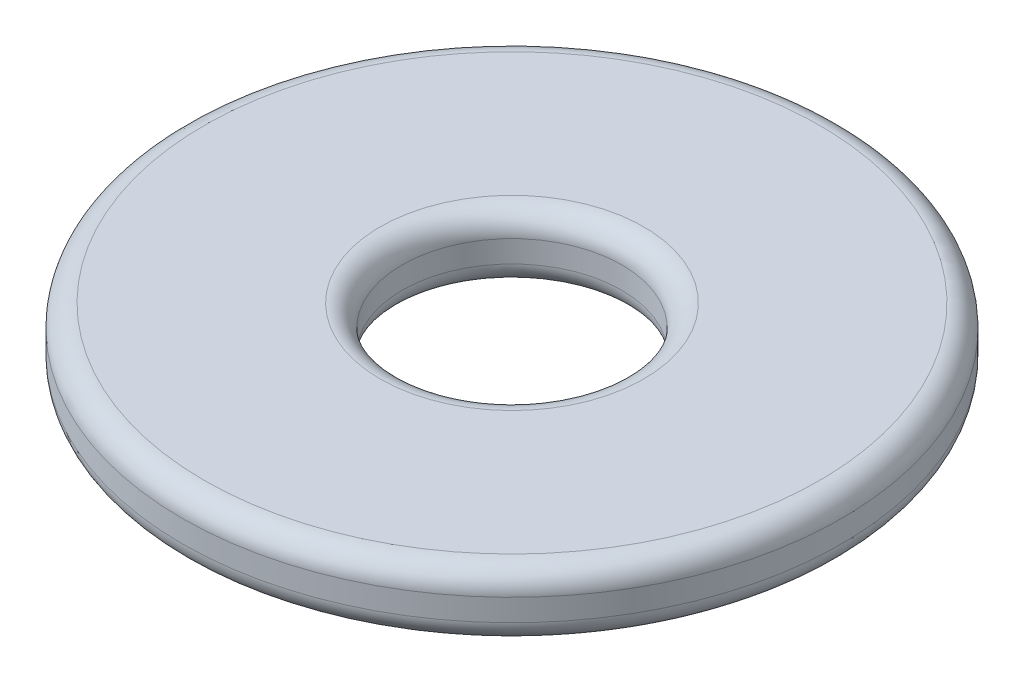
ISO-10303-21;
HEADER;
FILE_DESCRIPTION(('STEP AP214'),'2;1');
FILE_NAME('part.step','',(''),(''),'','','');
FILE_SCHEMA(('AUTOMOTIVE_DESIGN { 1 0 10303 214 1 1 1 1 }'));
ENDSEC;
DATA;
#1=APPLICATION_CONTEXT('core data for automotive mechanical design processes');
#2=APPLICATION_PROTOCOL_DEFINITION('international standard','automotive_design',2000,#1);
#3=PRODUCT_CONTEXT('',#1,'mechanical');
#4=PRODUCT('Part','Part','',(#3));
#5=PRODUCT_RELATED_PRODUCT_CATEGORY('part','',(#4));
#6=PRODUCT_DEFINITION_FORMATION('','',#4);
#7=PRODUCT_DEFINITION_CONTEXT('part definition',#1,'design');
#8=PRODUCT_DEFINITION('design','',#6,#7);
#9=PRODUCT_DEFINITION_SHAPE('','',#8);
#10=(LENGTH_UNIT() NAMED_UNIT(*) SI_UNIT(.MILLI.,.METRE.));
#11=(NAMED_UNIT(*) PLANE_ANGLE_UNIT() SI_UNIT($,.RADIAN.));
#12=(NAMED_UNIT(*) SI_UNIT($,.STERADIAN.) SOLID_ANGLE_UNIT());
#13=UNCERTAINTY_MEASURE_WITH_UNIT(LENGTH_MEASURE(1.E-05),#10,'distance_accuracy_value','');
#14=(GEOMETRIC_REPRESENTATION_CONTEXT(3) GLOBAL_UNCERTAINTY_ASSIGNED_CONTEXT((#13)) GLOBAL_UNIT_ASSIGNED_CONTEXT((#10,
#11,#12)) REPRESENTATION_CONTEXT('',''));
#15=CARTESIAN_POINT('',(0.,0.,0.));
#16=DIRECTION('',(0.,0.,1.));
#17=DIRECTION('',(1.,0.,0.));
#18=AXIS2_PLACEMENT_3D('',#15,#16,#17);
#19=CARTESIAN_POINT('',(0.,1.2,0.));
#20=DIRECTION('',(0.,1.,0.));
#21=DIRECTION('',(0.,0.,1.));
#22=AXIS2_PLACEMENT_3D('',#19,#20,#21);
#23=PLANE('',#22);
#24=CARTESIAN_POINT('',(0.,1.2,0.));
#25=DIRECTION('',(0.,1.,0.));
#26=DIRECTION('',(0.,0.,1.));
#27=AXIS2_PLACEMENT_3D('',#24,#25,#26);
#28=CIRCLE('',#27,2.4);
#29=CARTESIAN_POINT('',(0.,1.2,2.4));
#30=VERTEX_POINT('',#29);
#31=EDGE_CURVE('E50',#30,#30,#28,.F.);
#32=ORIENTED_EDGE('',*,*,#31,.T.);
#33=EDGE_LOOP('',(#32));
#34=FACE_BOUND('',#33,.T.);
#35=CARTESIAN_POINT('',(0.,1.2,0.));
#36=DIRECTION('',(0.,1.,0.));
#37=DIRECTION('',(0.,0.,1.));
#38=AXIS2_PLACEMENT_3D('',#35,#36,#37);
#39=CIRCLE('',#38,5.6);
#40=CARTESIAN_POINT('',(0.,1.2,5.6));
#41=VERTEX_POINT('',#40);
#42=EDGE_CURVE('E54',#41,#41,#39,.T.);
#43=ORIENTED_EDGE('',*,*,#42,.T.);
#44=EDGE_LOOP('',(#43));
#45=FACE_BOUND('',#44,.T.);
#46=ADVANCED_FACE('F39',(#34,#45),#23,.T.);
#47=CARTESIAN_POINT('',(0.,0.,0.));
#48=DIRECTION('',(0.,1.,0.));
#49=DIRECTION('',(0.,0.,1.));
#50=AXIS2_PLACEMENT_3D('',#47,#48,#49);
#51=PLANE('',#50);
#52=CARTESIAN_POINT('',(0.,0.,0.));
#53=DIRECTION('',(0.,1.,0.));
#54=DIRECTION('',(0.,0.,1.));
#55=AXIS2_PLACEMENT_3D('',#52,#53,#54);
#56=CIRCLE('',#55,2.4);
#57=CARTESIAN_POINT('',(0.,0.,2.4));
#58=VERTEX_POINT('',#57);
#59=EDGE_CURVE('E65',#58,#58,#56,.T.);
#60=ORIENTED_EDGE('',*,*,#59,.T.);
#61=EDGE_LOOP('',(#60));
#62=FACE_BOUND('',#61,.T.);
#63=CARTESIAN_POINT('',(0.,0.,0.));
#64=DIRECTION('',(0.,1.,0.));
#65=DIRECTION('',(0.,0.,1.));
#66=AXIS2_PLACEMENT_3D('',#63,#64,#65);
#67=CIRCLE('',#66,5.6);
#68=CARTESIAN_POINT('',(0.,0.,5.6));
#69=VERTEX_POINT('',#68);
#70=EDGE_CURVE('E68',#69,#69,#67,.F.);
#71=ORIENTED_EDGE('',*,*,#70,.T.);
#72=EDGE_LOOP('',(#71));
#73=FACE_BOUND('',#72,.T.);
#74=ADVANCED_FACE('F72',(#62,#73),#51,.F.);
#75=CARTESIAN_POINT('',(0.,1.2,0.));
#76=DIRECTION('',(0.,-1.,0.));
#77=DIRECTION('',(0.,0.,-1.));
#78=AXIS2_PLACEMENT_3D('',#75,#76,#77);
#79=CYLINDRICAL_SURFACE('',#78,6.);
#80=CARTESIAN_POINT('',(0.,0.4,0.));
#81=DIRECTION('',(0.,1.,0.));
#82=DIRECTION('',(0.,0.,1.));
#83=AXIS2_PLACEMENT_3D('',#80,#81,#82);
#84=CIRCLE('',#83,6.);
#85=CARTESIAN_POINT('',(0.,0.4,6.));
#86=VERTEX_POINT('',#85);
#87=EDGE_CURVE('E10',#86,#86,#84,.T.);
#88=ORIENTED_EDGE('',*,*,#87,.T.);
#89=EDGE_LOOP('',(#88));
#90=FACE_BOUND('',#89,.T.);
#91=CARTESIAN_POINT('',(0.,0.8,0.));
#92=DIRECTION('',(0.,1.,0.));
#93=DIRECTION('',(0.,0.,1.));
#94=AXIS2_PLACEMENT_3D('',#91,#92,#93);
#95=CIRCLE('',#94,6.);
#96=CARTESIAN_POINT('',(0.,0.8,6.));
#97=VERTEX_POINT('',#96);
#98=EDGE_CURVE('E46',#97,#97,#95,.F.);
#99=ORIENTED_EDGE('',*,*,#98,.T.);
#100=EDGE_LOOP('',(#99));
#101=FACE_BOUND('',#100,.T.);
#102=ADVANCED_FACE('F92',(#90,#101),#79,.T.);
#103=CARTESIAN_POINT('',(0.,1.2,0.));
#104=DIRECTION('',(0.,-1.,0.));
#105=DIRECTION('',(0.,0.,-1.));
#106=AXIS2_PLACEMENT_3D('',#103,#104,#105);
#107=CYLINDRICAL_SURFACE('',#106,2.);
#108=CARTESIAN_POINT('',(0.,0.4,0.));
#109=DIRECTION('',(0.,1.,0.));
#110=DIRECTION('',(0.,0.,1.));
#111=AXIS2_PLACEMENT_3D('',#108,#109,#110);
#112=CIRCLE('',#111,2.);
#113=CARTESIAN_POINT('',(0.,0.4,2.));
#114=VERTEX_POINT('',#113);
#115=EDGE_CURVE('E59',#114,#114,#112,.F.);
#116=ORIENTED_EDGE('',*,*,#115,.T.);
#117=EDGE_LOOP('',(#116));
#118=FACE_BOUND('',#117,.T.);
#119=CARTESIAN_POINT('',(0.,0.8,0.));
#120=DIRECTION('',(0.,1.,0.));
#121=DIRECTION('',(0.,0.,1.));
#122=AXIS2_PLACEMENT_3D('',#119,#120,#121);
#123=CIRCLE('',#122,2.);
#124=CARTESIAN_POINT('',(0.,0.8,2.));
#125=VERTEX_POINT('',#124);
#126=EDGE_CURVE('E62',#125,#125,#123,.T.);
#127=ORIENTED_EDGE('',*,*,#126,.T.);
#128=EDGE_LOOP('',(#127));
#129=FACE_BOUND('',#128,.T.);
#130=ADVANCED_FACE('F97',(#118,#129),#107,.F.);
#131=CARTESIAN_POINT('',(0.,0.4,0.));
#132=DIRECTION('',(0.,1.,0.));
#133=DIRECTION('',(0.,0.,1.));
#134=AXIS2_PLACEMENT_3D('',#131,#132,#133);
#135=TOROIDAL_SURFACE('',#134,2.4,0.4);
#136=ORIENTED_EDGE('',*,*,#115,.F.);
#137=EDGE_LOOP('',(#136));
#138=FACE_BOUND('',#137,.T.);
#139=ORIENTED_EDGE('',*,*,#59,.F.);
#140=EDGE_LOOP('',(#139));
#141=FACE_BOUND('',#140,.T.);
#142=ADVANCED_FACE('F83',(#138,#141),#135,.T.);
#143=CARTESIAN_POINT('',(0.,0.8,0.));
#144=DIRECTION('',(0.,1.,0.));
#145=DIRECTION('',(0.,0.,1.));
#146=AXIS2_PLACEMENT_3D('',#143,#144,#145);
#147=TOROIDAL_SURFACE('',#146,2.4,0.4);
#148=ORIENTED_EDGE('',*,*,#31,.F.);
#149=EDGE_LOOP('',(#148));
#150=FACE_BOUND('',#149,.T.);
#151=ORIENTED_EDGE('',*,*,#126,.F.);
#152=EDGE_LOOP('',(#151));
#153=FACE_BOUND('',#152,.T.);
#154=ADVANCED_FACE('F77',(#150,#153),#147,.T.);
#155=CARTESIAN_POINT('',(0.,0.4,0.));
#156=DIRECTION('',(0.,1.,0.));
#157=DIRECTION('',(0.,0.,1.));
#158=AXIS2_PLACEMENT_3D('',#155,#156,#157);
#159=TOROIDAL_SURFACE('',#158,5.6,0.4);
#160=ORIENTED_EDGE('',*,*,#70,.F.);
#161=EDGE_LOOP('',(#160));
#162=FACE_BOUND('',#161,.T.);
#163=ORIENTED_EDGE('',*,*,#87,.F.);
#164=EDGE_LOOP('',(#163));
#165=FACE_BOUND('',#164,.T.);
#166=ADVANCED_FACE('F74',(#162,#165),#159,.T.);
#167=CARTESIAN_POINT('',(0.,0.8,0.));
#168=DIRECTION('',(0.,1.,0.));
#169=DIRECTION('',(0.,0.,1.));
#170=AXIS2_PLACEMENT_3D('',#167,#168,#169);
#171=TOROIDAL_SURFACE('',#170,5.6,0.4);
#172=ORIENTED_EDGE('',*,*,#98,.F.);
#173=EDGE_LOOP('',(#172));
#174=FACE_BOUND('',#173,.T.);
#175=ORIENTED_EDGE('',*,*,#42,.F.);
#176=EDGE_LOOP('',(#175));
#177=FACE_BOUND('',#176,.T.);
#178=ADVANCED_FACE('F41',(#174,#177),#171,.T.);
#179=CLOSED_SHELL('',(#46,#74,#102,#130,#142,#154,#166,#178));
#180=MANIFOLD_SOLID_BREP('B2',#179);
#181=ADVANCED_BREP_SHAPE_REPRESENTATION('',(#18,#180),#14);
#182=SHAPE_DEFINITION_REPRESENTATION(#9,#181);
ENDSEC;
END-ISO-10303-21;
